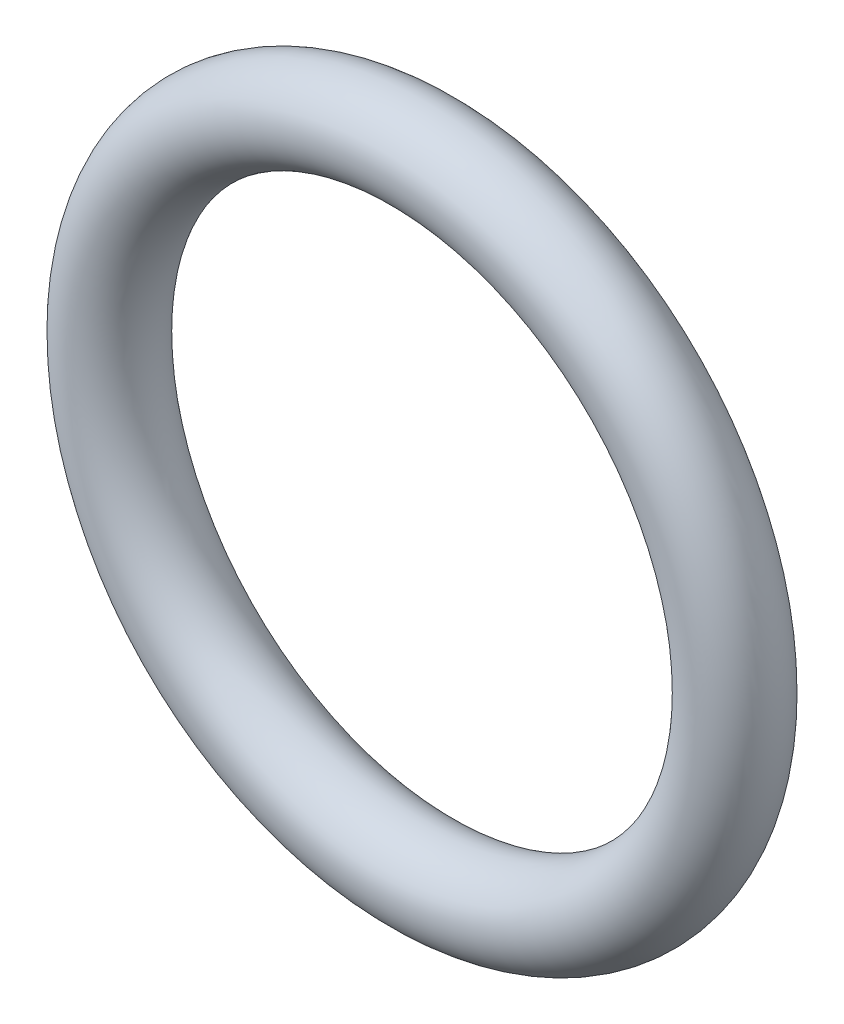
ISO-10303-21;
HEADER;
FILE_DESCRIPTION(('STEP AP214'),'2;1');
FILE_NAME('part.step','',(''),(''),'','','');
FILE_SCHEMA(('AUTOMOTIVE_DESIGN { 1 0 10303 214 1 1 1 1 }'));
ENDSEC;
DATA;
#1=APPLICATION_CONTEXT('core data for automotive mechanical design processes');
#2=APPLICATION_PROTOCOL_DEFINITION('international standard','automotive_design',2000,#1);
#3=PRODUCT_CONTEXT('',#1,'mechanical');
#4=PRODUCT('Part','Part','',(#3));
#5=PRODUCT_RELATED_PRODUCT_CATEGORY('part','',(#4));
#6=PRODUCT_DEFINITION_FORMATION('','',#4);
#7=PRODUCT_DEFINITION_CONTEXT('part definition',#1,'design');
#8=PRODUCT_DEFINITION('design','',#6,#7);
#9=PRODUCT_DEFINITION_SHAPE('','',#8);
#10=(LENGTH_UNIT() NAMED_UNIT(*) SI_UNIT(.MILLI.,.METRE.));
#11=(NAMED_UNIT(*) PLANE_ANGLE_UNIT() SI_UNIT($,.RADIAN.));
#12=(NAMED_UNIT(*) SI_UNIT($,.STERADIAN.) SOLID_ANGLE_UNIT());
#13=UNCERTAINTY_MEASURE_WITH_UNIT(LENGTH_MEASURE(1.E-05),#10,'distance_accuracy_value','');
#14=(GEOMETRIC_REPRESENTATION_CONTEXT(3) GLOBAL_UNCERTAINTY_ASSIGNED_CONTEXT((#13)) GLOBAL_UNIT_ASSIGNED_CONTEXT((#10,
#11,#12)) REPRESENTATION_CONTEXT('',''));
#15=CARTESIAN_POINT('',(0.,0.,0.));
#16=DIRECTION('',(0.,0.,1.));
#17=DIRECTION('',(1.,0.,0.));
#18=AXIS2_PLACEMENT_3D('',#15,#16,#17);
#19=CARTESIAN_POINT('',(0.,0.,0.));
#20=DIRECTION('',(0.,0.,1.));
#21=DIRECTION('',(1.,0.,0.));
#22=AXIS2_PLACEMENT_3D('',#19,#20,#21);
#23=TOROIDAL_SURFACE('',#22,6.2992,0.888999999999998);
#24=CARTESIAN_POINT('',(7.1882,0.,0.));
#25=VERTEX_POINT('',#24);
#26=VERTEX_LOOP('',#25);
#27=FACE_BOUND('',#26,.T.);
#28=ADVANCED_FACE('F27',(#27),#23,.T.);
#29=CLOSED_SHELL('',(#28));
#30=MANIFOLD_SOLID_BREP('B2',#29);
#31=ADVANCED_BREP_SHAPE_REPRESENTATION('',(#18,#30),#14);
#32=SHAPE_DEFINITION_REPRESENTATION(#9,#31);
ENDSEC;
END-ISO-10303-21;
